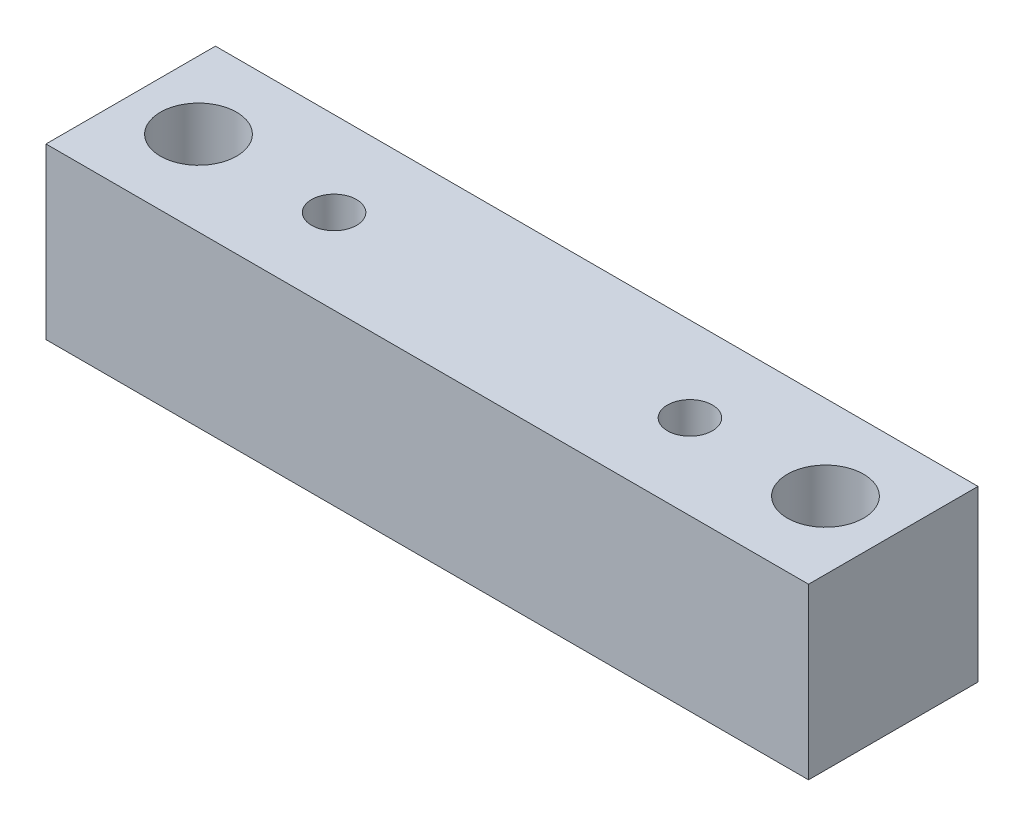
ISO-10303-21;
HEADER;
FILE_DESCRIPTION(('STEP AP214'),'2;1');
FILE_NAME('part.step','',(''),(''),'','','');
FILE_SCHEMA(('AUTOMOTIVE_DESIGN { 1 0 10303 214 1 1 1 1 }'));
ENDSEC;
DATA;
#1=APPLICATION_CONTEXT('core data for automotive mechanical design processes');
#2=APPLICATION_PROTOCOL_DEFINITION('international standard','automotive_design',2000,#1);
#3=PRODUCT_CONTEXT('',#1,'mechanical');
#4=PRODUCT('Part','Part','',(#3));
#5=PRODUCT_RELATED_PRODUCT_CATEGORY('part','',(#4));
#6=PRODUCT_DEFINITION_FORMATION('','',#4);
#7=PRODUCT_DEFINITION_CONTEXT('part definition',#1,'design');
#8=PRODUCT_DEFINITION('design','',#6,#7);
#9=PRODUCT_DEFINITION_SHAPE('','',#8);
#10=(LENGTH_UNIT() NAMED_UNIT(*) SI_UNIT(.MILLI.,.METRE.));
#11=(NAMED_UNIT(*) PLANE_ANGLE_UNIT() SI_UNIT($,.RADIAN.));
#12=(NAMED_UNIT(*) SI_UNIT($,.STERADIAN.) SOLID_ANGLE_UNIT());
#13=UNCERTAINTY_MEASURE_WITH_UNIT(LENGTH_MEASURE(1.E-05),#10,'distance_accuracy_value','');
#14=(GEOMETRIC_REPRESENTATION_CONTEXT(3) GLOBAL_UNCERTAINTY_ASSIGNED_CONTEXT((#13)) GLOBAL_UNIT_ASSIGNED_CONTEXT((#10,
#11,#12)) REPRESENTATION_CONTEXT('',''));
#15=CARTESIAN_POINT('',(0.,0.,0.));
#16=DIRECTION('',(0.,0.,1.));
#17=DIRECTION('',(1.,0.,0.));
#18=AXIS2_PLACEMENT_3D('',#15,#16,#17);
#19=CARTESIAN_POINT('',(-37.0000000000001,20.,0.));
#20=DIRECTION('',(0.,-1.,0.));
#21=DIRECTION('',(0.,0.,-1.));
#22=AXIS2_PLACEMENT_3D('',#19,#20,#21);
#23=CYLINDRICAL_SURFACE('',#22,2.75);
#24=CARTESIAN_POINT('',(-37.0000000000001,0.,0.));
#25=DIRECTION('',(0.,1.,0.));
#26=DIRECTION('',(0.,0.,1.));
#27=AXIS2_PLACEMENT_3D('',#24,#25,#26);
#28=CIRCLE('',#27,2.75);
#29=CARTESIAN_POINT('',(-37.0000000000001,0.,2.75));
#30=VERTEX_POINT('',#29);
#31=EDGE_CURVE('E301',#30,#30,#28,.T.);
#32=ORIENTED_EDGE('',*,*,#31,.F.);
#33=EDGE_LOOP('',(#32));
#34=FACE_BOUND('',#33,.T.);
#35=CARTESIAN_POINT('',(-37.0000000000001,7.,0.));
#36=DIRECTION('',(0.,1.,0.));
#37=DIRECTION('',(0.,0.,1.));
#38=AXIS2_PLACEMENT_3D('',#35,#36,#37);
#39=CIRCLE('',#38,2.75);
#40=CARTESIAN_POINT('',(-37.0000000000001,7.,2.75));
#41=VERTEX_POINT('',#40);
#42=EDGE_CURVE('E45',#41,#41,#39,.T.);
#43=ORIENTED_EDGE('',*,*,#42,.T.);
#44=EDGE_LOOP('',(#43));
#45=FACE_BOUND('',#44,.T.);
#46=ADVANCED_FACE('F41',(#34,#45),#23,.F.);
#47=CARTESIAN_POINT('',(36.9999999999999,20.,0.));
#48=DIRECTION('',(0.,-1.,0.));
#49=DIRECTION('',(0.,0.,-1.));
#50=AXIS2_PLACEMENT_3D('',#47,#48,#49);
#51=CYLINDRICAL_SURFACE('',#50,2.75);
#52=CARTESIAN_POINT('',(36.9999999999999,0.,0.));
#53=DIRECTION('',(0.,1.,0.));
#54=DIRECTION('',(0.,0.,1.));
#55=AXIS2_PLACEMENT_3D('',#52,#53,#54);
#56=CIRCLE('',#55,2.75);
#57=CARTESIAN_POINT('',(36.9999999999999,0.,2.75));
#58=VERTEX_POINT('',#57);
#59=EDGE_CURVE('E297',#58,#58,#56,.T.);
#60=ORIENTED_EDGE('',*,*,#59,.F.);
#61=EDGE_LOOP('',(#60));
#62=FACE_BOUND('',#61,.T.);
#63=CARTESIAN_POINT('',(36.9999999999999,7.,0.));
#64=DIRECTION('',(0.,1.,0.));
#65=DIRECTION('',(0.,0.,1.));
#66=AXIS2_PLACEMENT_3D('',#63,#64,#65);
#67=CIRCLE('',#66,2.75);
#68=CARTESIAN_POINT('',(36.9999999999999,7.,2.75));
#69=VERTEX_POINT('',#68);
#70=EDGE_CURVE('E356',#69,#69,#67,.T.);
#71=ORIENTED_EDGE('',*,*,#70,.T.);
#72=EDGE_LOOP('',(#71));
#73=FACE_BOUND('',#72,.T.);
#74=ADVANCED_FACE('F442',(#62,#73),#51,.F.);
#75=CARTESIAN_POINT('',(-21.,20.,0.));
#76=DIRECTION('',(0.,-1.,0.));
#77=DIRECTION('',(0.,0.,-1.));
#78=AXIS2_PLACEMENT_3D('',#75,#76,#77);
#79=CYLINDRICAL_SURFACE('',#78,2.65);
#80=CARTESIAN_POINT('',(-21.,20.,0.));
#81=DIRECTION('',(0.,1.,0.));
#82=DIRECTION('',(0.,0.,1.));
#83=AXIS2_PLACEMENT_3D('',#80,#81,#82);
#84=CIRCLE('',#83,2.65);
#85=CARTESIAN_POINT('',(-21.,20.,2.65));
#86=VERTEX_POINT('',#85);
#87=EDGE_CURVE('E310',#86,#86,#84,.T.);
#88=ORIENTED_EDGE('',*,*,#87,.T.);
#89=EDGE_LOOP('',(#88));
#90=FACE_BOUND('',#89,.T.);
#91=CARTESIAN_POINT('',(-21.,14.,0.));
#92=DIRECTION('',(0.,-1.,0.));
#93=DIRECTION('',(0.,0.,-1.));
#94=AXIS2_PLACEMENT_3D('',#91,#92,#93);
#95=CIRCLE('',#94,2.65);
#96=CARTESIAN_POINT('',(-21.,14.,-2.65));
#97=VERTEX_POINT('',#96);
#98=EDGE_CURVE('E302',#97,#97,#95,.T.);
#99=ORIENTED_EDGE('',*,*,#98,.T.);
#100=EDGE_LOOP('',(#99));
#101=FACE_BOUND('',#100,.T.);
#102=ADVANCED_FACE('F400',(#90,#101),#79,.F.);
#103=CARTESIAN_POINT('',(21.,20.,0.));
#104=DIRECTION('',(0.,-1.,0.));
#105=DIRECTION('',(0.,0.,-1.));
#106=AXIS2_PLACEMENT_3D('',#103,#104,#105);
#107=CYLINDRICAL_SURFACE('',#106,2.65);
#108=CARTESIAN_POINT('',(21.,20.,0.));
#109=DIRECTION('',(0.,1.,0.));
#110=DIRECTION('',(0.,0.,1.));
#111=AXIS2_PLACEMENT_3D('',#108,#109,#110);
#112=CIRCLE('',#111,2.65);
#113=CARTESIAN_POINT('',(21.,20.,2.64999999999999));
#114=VERTEX_POINT('',#113);
#115=EDGE_CURVE('E306',#114,#114,#112,.T.);
#116=ORIENTED_EDGE('',*,*,#115,.T.);
#117=EDGE_LOOP('',(#116));
#118=FACE_BOUND('',#117,.T.);
#119=CARTESIAN_POINT('',(21.,14.,0.));
#120=DIRECTION('',(0.,-1.,0.));
#121=DIRECTION('',(0.,0.,-1.));
#122=AXIS2_PLACEMENT_3D('',#119,#120,#121);
#123=CIRCLE('',#122,2.65);
#124=CARTESIAN_POINT('',(21.,14.,-2.65000000000001));
#125=VERTEX_POINT('',#124);
#126=EDGE_CURVE('E222',#125,#125,#123,.T.);
#127=ORIENTED_EDGE('',*,*,#126,.T.);
#128=EDGE_LOOP('',(#127));
#129=FACE_BOUND('',#128,.T.);
#130=ADVANCED_FACE('F388',(#118,#129),#107,.F.);
#131=CARTESIAN_POINT('',(0.,20.,0.));
#132=DIRECTION('',(0.,-1.,0.));
#133=DIRECTION('',(0.,0.,-1.));
#134=AXIS2_PLACEMENT_3D('',#131,#132,#133);
#135=PLANE('',#134);
#136=CARTESIAN_POINT('',(-37.0000000000001,20.,0.));
#137=DIRECTION('',(0.,1.,0.));
#138=DIRECTION('',(0.,0.,1.));
#139=AXIS2_PLACEMENT_3D('',#136,#137,#138);
#140=CIRCLE('',#139,4.5);
#141=CARTESIAN_POINT('',(-37.0000000000001,20.,4.5));
#142=VERTEX_POINT('',#141);
#143=EDGE_CURVE('E366',#142,#142,#140,.T.);
#144=ORIENTED_EDGE('',*,*,#143,.F.);
#145=EDGE_LOOP('',(#144));
#146=FACE_BOUND('',#145,.T.);
#147=CARTESIAN_POINT('',(36.9999999999999,20.,0.));
#148=DIRECTION('',(0.,1.,0.));
#149=DIRECTION('',(0.,0.,1.));
#150=AXIS2_PLACEMENT_3D('',#147,#148,#149);
#151=CIRCLE('',#150,4.5);
#152=CARTESIAN_POINT('',(36.9999999999999,20.,4.5));
#153=VERTEX_POINT('',#152);
#154=EDGE_CURVE('E188',#153,#153,#151,.T.);
#155=ORIENTED_EDGE('',*,*,#154,.F.);
#156=EDGE_LOOP('',(#155));
#157=FACE_BOUND('',#156,.T.);
#158=DIRECTION('',(0.,0.,-1.));
#159=VECTOR('',#158,1.);
#160=CARTESIAN_POINT('',(44.9999999999999,20.,9.99999999999999));
#161=LINE('',#160,#159);
#162=CARTESIAN_POINT('',(44.9999999999999,20.,9.99999999999999));
#163=VERTEX_POINT('',#162);
#164=CARTESIAN_POINT('',(44.9999999999999,20.,-9.99999999999999));
#165=VERTEX_POINT('',#164);
#166=EDGE_CURVE('E315',#163,#165,#161,.T.);
#167=ORIENTED_EDGE('',*,*,#166,.T.);
#168=DIRECTION('',(-1.,0.,0.));
#169=VECTOR('',#168,1.);
#170=CARTESIAN_POINT('',(-45.0000000000001,20.,-9.99999999999999));
#171=LINE('',#170,#169);
#172=CARTESIAN_POINT('',(-45.0000000000001,20.,-9.99999999999999));
#173=VERTEX_POINT('',#172);
#174=EDGE_CURVE('E319',#165,#173,#171,.T.);
#175=ORIENTED_EDGE('',*,*,#174,.T.);
#176=DIRECTION('',(0.,0.,1.));
#177=VECTOR('',#176,1.);
#178=CARTESIAN_POINT('',(-45.0000000000001,20.,10.));
#179=LINE('',#178,#177);
#180=CARTESIAN_POINT('',(-45.0000000000001,20.,10.));
#181=VERTEX_POINT('',#180);
#182=EDGE_CURVE('E323',#173,#181,#179,.T.);
#183=ORIENTED_EDGE('',*,*,#182,.T.);
#184=DIRECTION('',(1.,0.,0.));
#185=VECTOR('',#184,1.);
#186=CARTESIAN_POINT('',(-45.0000000000001,20.,10.));
#187=LINE('',#186,#185);
#188=EDGE_CURVE('E326',#181,#163,#187,.T.);
#189=ORIENTED_EDGE('',*,*,#188,.T.);
#190=EDGE_LOOP('',(#167,#175,#183,#189));
#191=FACE_BOUND('',#190,.T.);
#192=ORIENTED_EDGE('',*,*,#87,.F.);
#193=EDGE_LOOP('',(#192));
#194=FACE_BOUND('',#193,.T.);
#195=ORIENTED_EDGE('',*,*,#115,.F.);
#196=EDGE_LOOP('',(#195));
#197=FACE_BOUND('',#196,.T.);
#198=ADVANCED_FACE('F384',(#146,#157,#191,#194,#197),#135,.F.);
#199=CARTESIAN_POINT('',(0.,0.,0.));
#200=DIRECTION('',(0.,-1.,0.));
#201=DIRECTION('',(0.,0.,-1.));
#202=AXIS2_PLACEMENT_3D('',#199,#200,#201);
#203=PLANE('',#202);
#204=DIRECTION('',(0.5,0.,0.866025403784439));
#205=VECTOR('',#204,1.);
#206=CARTESIAN_POINT('',(-18.6328638963225,0.,-4.1));
#207=LINE('',#206,#205);
#208=CARTESIAN_POINT('',(-18.6328638963225,0.,-4.1));
#209=VERTEX_POINT('',#208);
#210=CARTESIAN_POINT('',(-16.2657277926451,0.,0.));
#211=VERTEX_POINT('',#210);
#212=EDGE_CURVE('E59',#209,#211,#207,.T.);
#213=ORIENTED_EDGE('',*,*,#212,.F.);
#214=DIRECTION('',(1.,0.,0.));
#215=VECTOR('',#214,1.);
#216=CARTESIAN_POINT('',(-23.3671361036775,0.,-4.1));
#217=LINE('',#216,#215);
#218=CARTESIAN_POINT('',(-23.3671361036775,0.,-4.1));
#219=VERTEX_POINT('',#218);
#220=EDGE_CURVE('E181',#219,#209,#217,.T.);
#221=ORIENTED_EDGE('',*,*,#220,.F.);
#222=DIRECTION('',(0.5,0.,-0.866025403784439));
#223=VECTOR('',#222,1.);
#224=CARTESIAN_POINT('',(-25.7342722073549,0.,0.));
#225=LINE('',#224,#223);
#226=CARTESIAN_POINT('',(-25.7342722073549,0.,0.));
#227=VERTEX_POINT('',#226);
#228=EDGE_CURVE('E185',#227,#219,#225,.T.);
#229=ORIENTED_EDGE('',*,*,#228,.F.);
#230=DIRECTION('',(-0.5,0.,-0.866025403784439));
#231=VECTOR('',#230,1.);
#232=CARTESIAN_POINT('',(-23.3671361036775,0.,4.1));
#233=LINE('',#232,#231);
#234=CARTESIAN_POINT('',(-23.3671361036775,0.,4.1));
#235=VERTEX_POINT('',#234);
#236=EDGE_CURVE('E212',#235,#227,#233,.T.);
#237=ORIENTED_EDGE('',*,*,#236,.F.);
#238=DIRECTION('',(-1.,0.,0.));
#239=VECTOR('',#238,1.);
#240=CARTESIAN_POINT('',(-18.6328638963225,0.,4.1));
#241=LINE('',#240,#239);
#242=CARTESIAN_POINT('',(-18.6328638963225,0.,4.1));
#243=VERTEX_POINT('',#242);
#244=EDGE_CURVE('E208',#243,#235,#241,.T.);
#245=ORIENTED_EDGE('',*,*,#244,.F.);
#246=DIRECTION('',(-0.5,0.,0.866025403784438));
#247=VECTOR('',#246,1.);
#248=CARTESIAN_POINT('',(-16.2657277926451,0.,0.));
#249=LINE('',#248,#247);
#250=EDGE_CURVE('E204',#211,#243,#249,.T.);
#251=ORIENTED_EDGE('',*,*,#250,.F.);
#252=EDGE_LOOP('',(#213,#221,#229,#237,#245,#251));
#253=FACE_BOUND('',#252,.T.);
#254=DIRECTION('',(0.5,0.,0.866025403784439));
#255=VECTOR('',#254,1.);
#256=CARTESIAN_POINT('',(23.3671361036775,0.,-4.10000000000001));
#257=LINE('',#256,#255);
#258=CARTESIAN_POINT('',(23.3671361036775,0.,-4.10000000000001));
#259=VERTEX_POINT('',#258);
#260=CARTESIAN_POINT('',(25.7342722073549,0.,0.));
#261=VERTEX_POINT('',#260);
#262=EDGE_CURVE('E67',#259,#261,#257,.T.);
#263=ORIENTED_EDGE('',*,*,#262,.F.);
#264=DIRECTION('',(1.,0.,0.));
#265=VECTOR('',#264,1.);
#266=CARTESIAN_POINT('',(18.6328638963225,0.,-4.10000000000001));
#267=LINE('',#266,#265);
#268=CARTESIAN_POINT('',(18.6328638963225,0.,-4.10000000000001));
#269=VERTEX_POINT('',#268);
#270=EDGE_CURVE('E239',#269,#259,#267,.T.);
#271=ORIENTED_EDGE('',*,*,#270,.F.);
#272=DIRECTION('',(0.5,0.,-0.866025403784438));
#273=VECTOR('',#272,1.);
#274=CARTESIAN_POINT('',(16.2657277926451,0.,0.));
#275=LINE('',#274,#273);
#276=CARTESIAN_POINT('',(16.2657277926451,0.,0.));
#277=VERTEX_POINT('',#276);
#278=EDGE_CURVE('E274',#277,#269,#275,.T.);
#279=ORIENTED_EDGE('',*,*,#278,.F.);
#280=DIRECTION('',(-0.5,0.,-0.866025403784439));
#281=VECTOR('',#280,1.);
#282=CARTESIAN_POINT('',(18.6328638963225,0.,4.1));
#283=LINE('',#282,#281);
#284=CARTESIAN_POINT('',(18.6328638963225,0.,4.1));
#285=VERTEX_POINT('',#284);
#286=EDGE_CURVE('E270',#285,#277,#283,.T.);
#287=ORIENTED_EDGE('',*,*,#286,.F.);
#288=DIRECTION('',(-1.,0.,0.));
#289=VECTOR('',#288,1.);
#290=CARTESIAN_POINT('',(23.3671361036775,0.,4.1));
#291=LINE('',#290,#289);
#292=CARTESIAN_POINT('',(23.3671361036775,0.,4.1));
#293=VERTEX_POINT('',#292);
#294=EDGE_CURVE('E266',#293,#285,#291,.T.);
#295=ORIENTED_EDGE('',*,*,#294,.F.);
#296=DIRECTION('',(-0.5,0.,0.866025403784438));
#297=VECTOR('',#296,1.);
#298=CARTESIAN_POINT('',(25.7342722073549,0.,0.));
#299=LINE('',#298,#297);
#300=EDGE_CURVE('E262',#261,#293,#299,.T.);
#301=ORIENTED_EDGE('',*,*,#300,.F.);
#302=EDGE_LOOP('',(#263,#271,#279,#287,#295,#301));
#303=FACE_BOUND('',#302,.T.);
#304=ORIENTED_EDGE('',*,*,#31,.T.);
#305=EDGE_LOOP('',(#304));
#306=FACE_BOUND('',#305,.T.);
#307=DIRECTION('',(0.,0.,-1.));
#308=VECTOR('',#307,1.);
#309=CARTESIAN_POINT('',(44.9999999999999,0.,9.99999999999999));
#310=LINE('',#309,#308);
#311=CARTESIAN_POINT('',(44.9999999999999,0.,9.99999999999999));
#312=VERTEX_POINT('',#311);
#313=CARTESIAN_POINT('',(44.9999999999999,0.,-9.99999999999999));
#314=VERTEX_POINT('',#313);
#315=EDGE_CURVE('E314',#312,#314,#310,.T.);
#316=ORIENTED_EDGE('',*,*,#315,.F.);
#317=DIRECTION('',(1.,0.,0.));
#318=VECTOR('',#317,1.);
#319=CARTESIAN_POINT('',(-45.0000000000001,0.,10.));
#320=LINE('',#319,#318);
#321=CARTESIAN_POINT('',(-45.0000000000001,0.,10.));
#322=VERTEX_POINT('',#321);
#323=EDGE_CURVE('E320',#322,#312,#320,.T.);
#324=ORIENTED_EDGE('',*,*,#323,.F.);
#325=DIRECTION('',(0.,0.,1.));
#326=VECTOR('',#325,1.);
#327=CARTESIAN_POINT('',(-45.0000000000001,0.,10.));
#328=LINE('',#327,#326);
#329=CARTESIAN_POINT('',(-45.0000000000001,0.,-9.99999999999999));
#330=VERTEX_POINT('',#329);
#331=EDGE_CURVE('E336',#330,#322,#328,.T.);
#332=ORIENTED_EDGE('',*,*,#331,.F.);
#333=DIRECTION('',(-1.,0.,0.));
#334=VECTOR('',#333,1.);
#335=CARTESIAN_POINT('',(-45.0000000000001,0.,-9.99999999999999));
#336=LINE('',#335,#334);
#337=EDGE_CURVE('E333',#314,#330,#336,.T.);
#338=ORIENTED_EDGE('',*,*,#337,.F.);
#339=EDGE_LOOP('',(#316,#324,#332,#338));
#340=FACE_BOUND('',#339,.T.);
#341=ORIENTED_EDGE('',*,*,#59,.T.);
#342=EDGE_LOOP('',(#341));
#343=FACE_BOUND('',#342,.T.);
#344=ADVANCED_FACE('F387',(#253,#303,#306,#340,#343),#203,.T.);
#345=CARTESIAN_POINT('',(44.9999999999999,20.,9.99999999999999));
#346=DIRECTION('',(-1.,0.,0.));
#347=DIRECTION('',(0.,0.,1.));
#348=AXIS2_PLACEMENT_3D('',#345,#346,#347);
#349=PLANE('',#348);
#350=ORIENTED_EDGE('',*,*,#315,.T.);
#351=DIRECTION('',(0.,-1.,0.));
#352=VECTOR('',#351,1.);
#353=CARTESIAN_POINT('',(44.9999999999999,20.,-9.99999999999999));
#354=LINE('',#353,#352);
#355=EDGE_CURVE('E11',#165,#314,#354,.T.);
#356=ORIENTED_EDGE('',*,*,#355,.F.);
#357=ORIENTED_EDGE('',*,*,#166,.F.);
#358=DIRECTION('',(0.,-1.,0.));
#359=VECTOR('',#358,1.);
#360=CARTESIAN_POINT('',(44.9999999999999,20.,9.99999999999999));
#361=LINE('',#360,#359);
#362=EDGE_CURVE('E329',#163,#312,#361,.T.);
#363=ORIENTED_EDGE('',*,*,#362,.T.);
#364=EDGE_LOOP('',(#350,#356,#357,#363));
#365=FACE_BOUND('',#364,.T.);
#366=ADVANCED_FACE('F43',(#365),#349,.F.);
#367=CARTESIAN_POINT('',(-45.0000000000001,20.,-9.99999999999999));
#368=DIRECTION('',(0.,0.,1.));
#369=DIRECTION('',(1.,0.,0.));
#370=AXIS2_PLACEMENT_3D('',#367,#368,#369);
#371=PLANE('',#370);
#372=ORIENTED_EDGE('',*,*,#337,.T.);
#373=DIRECTION('',(0.,-1.,0.));
#374=VECTOR('',#373,1.);
#375=CARTESIAN_POINT('',(-45.0000000000001,20.,-9.99999999999999));
#376=LINE('',#375,#374);
#377=EDGE_CURVE('E51',#173,#330,#376,.T.);
#378=ORIENTED_EDGE('',*,*,#377,.F.);
#379=ORIENTED_EDGE('',*,*,#174,.F.);
#380=ORIENTED_EDGE('',*,*,#355,.T.);
#381=EDGE_LOOP('',(#372,#378,#379,#380));
#382=FACE_BOUND('',#381,.T.);
#383=ADVANCED_FACE('F462',(#382),#371,.F.);
#384=CARTESIAN_POINT('',(-45.0000000000001,20.,10.));
#385=DIRECTION('',(1.,0.,0.));
#386=DIRECTION('',(0.,0.,-1.));
#387=AXIS2_PLACEMENT_3D('',#384,#385,#386);
#388=PLANE('',#387);
#389=ORIENTED_EDGE('',*,*,#331,.T.);
#390=DIRECTION('',(0.,-1.,0.));
#391=VECTOR('',#390,1.);
#392=CARTESIAN_POINT('',(-45.0000000000001,20.,10.));
#393=LINE('',#392,#391);
#394=EDGE_CURVE('E344',#181,#322,#393,.T.);
#395=ORIENTED_EDGE('',*,*,#394,.F.);
#396=ORIENTED_EDGE('',*,*,#182,.F.);
#397=ORIENTED_EDGE('',*,*,#377,.T.);
#398=EDGE_LOOP('',(#389,#395,#396,#397));
#399=FACE_BOUND('',#398,.T.);
#400=ADVANCED_FACE('F459',(#399),#388,.F.);
#401=CARTESIAN_POINT('',(-45.0000000000001,20.,10.));
#402=DIRECTION('',(0.,0.,-1.));
#403=DIRECTION('',(-1.,0.,0.));
#404=AXIS2_PLACEMENT_3D('',#401,#402,#403);
#405=PLANE('',#404);
#406=ORIENTED_EDGE('',*,*,#323,.T.);
#407=ORIENTED_EDGE('',*,*,#362,.F.);
#408=ORIENTED_EDGE('',*,*,#188,.F.);
#409=ORIENTED_EDGE('',*,*,#394,.T.);
#410=EDGE_LOOP('',(#406,#407,#408,#409));
#411=FACE_BOUND('',#410,.T.);
#412=ADVANCED_FACE('F456',(#411),#405,.F.);
#413=CARTESIAN_POINT('',(23.3671361036775,14.,-4.10000000000001));
#414=DIRECTION('',(0.866025403784438,0.,-0.5));
#415=DIRECTION('',(-0.5,0.,-0.866025403784439));
#416=AXIS2_PLACEMENT_3D('',#413,#414,#415);
#417=PLANE('',#416);
#418=ORIENTED_EDGE('',*,*,#262,.T.);
#419=DIRECTION('',(0.,-1.,0.));
#420=VECTOR('',#419,1.);
#421=CARTESIAN_POINT('',(25.7342722073549,14.,0.));
#422=LINE('',#421,#420);
#423=CARTESIAN_POINT('',(25.7342722073549,14.,0.));
#424=VERTEX_POINT('',#423);
#425=EDGE_CURVE('E259',#424,#261,#422,.T.);
#426=ORIENTED_EDGE('',*,*,#425,.F.);
#427=DIRECTION('',(0.5,0.,0.866025403784439));
#428=VECTOR('',#427,1.);
#429=CARTESIAN_POINT('',(23.3671361036775,14.,-4.10000000000001));
#430=LINE('',#429,#428);
#431=CARTESIAN_POINT('',(23.3671361036775,14.,-4.10000000000001));
#432=VERTEX_POINT('',#431);
#433=EDGE_CURVE('E234',#432,#424,#430,.T.);
#434=ORIENTED_EDGE('',*,*,#433,.F.);
#435=DIRECTION('',(0.,-1.,0.));
#436=VECTOR('',#435,1.);
#437=CARTESIAN_POINT('',(23.3671361036775,14.,-4.10000000000001));
#438=LINE('',#437,#436);
#439=EDGE_CURVE('E205',#432,#259,#438,.T.);
#440=ORIENTED_EDGE('',*,*,#439,.T.);
#441=EDGE_LOOP('',(#418,#426,#434,#440));
#442=FACE_BOUND('',#441,.T.);
#443=ADVANCED_FACE('F412',(#442),#417,.F.);
#444=CARTESIAN_POINT('',(18.6328638963225,14.,-4.10000000000001));
#445=DIRECTION('',(0.,0.,-1.));
#446=DIRECTION('',(-1.,0.,0.));
#447=AXIS2_PLACEMENT_3D('',#444,#445,#446);
#448=PLANE('',#447);
#449=ORIENTED_EDGE('',*,*,#270,.T.);
#450=ORIENTED_EDGE('',*,*,#439,.F.);
#451=DIRECTION('',(1.,0.,0.));
#452=VECTOR('',#451,1.);
#453=CARTESIAN_POINT('',(18.6328638963225,14.,-4.10000000000001));
#454=LINE('',#453,#452);
#455=CARTESIAN_POINT('',(18.6328638963225,14.,-4.10000000000001));
#456=VERTEX_POINT('',#455);
#457=EDGE_CURVE('E255',#456,#432,#454,.T.);
#458=ORIENTED_EDGE('',*,*,#457,.F.);
#459=DIRECTION('',(0.,-1.,0.));
#460=VECTOR('',#459,1.);
#461=CARTESIAN_POINT('',(18.6328638963225,14.,-4.10000000000001));
#462=LINE('',#461,#460);
#463=EDGE_CURVE('E283',#456,#269,#462,.T.);
#464=ORIENTED_EDGE('',*,*,#463,.T.);
#465=EDGE_LOOP('',(#449,#450,#458,#464));
#466=FACE_BOUND('',#465,.T.);
#467=ADVANCED_FACE('F429',(#466),#448,.F.);
#468=CARTESIAN_POINT('',(16.2657277926451,14.,0.));
#469=DIRECTION('',(-0.866025403784438,0.,-0.5));
#470=DIRECTION('',(-0.5,0.,0.866025403784438));
#471=AXIS2_PLACEMENT_3D('',#468,#469,#470);
#472=PLANE('',#471);
#473=ORIENTED_EDGE('',*,*,#278,.T.);
#474=ORIENTED_EDGE('',*,*,#463,.F.);
#475=DIRECTION('',(0.5,0.,-0.866025403784438));
#476=VECTOR('',#475,1.);
#477=CARTESIAN_POINT('',(16.2657277926451,14.,0.));
#478=LINE('',#477,#476);
#479=CARTESIAN_POINT('',(16.2657277926451,14.,0.));
#480=VERTEX_POINT('',#479);
#481=EDGE_CURVE('E251',#480,#456,#478,.T.);
#482=ORIENTED_EDGE('',*,*,#481,.F.);
#483=DIRECTION('',(0.,-1.,0.));
#484=VECTOR('',#483,1.);
#485=CARTESIAN_POINT('',(16.2657277926451,14.,0.));
#486=LINE('',#485,#484);
#487=EDGE_CURVE('E286',#480,#277,#486,.T.);
#488=ORIENTED_EDGE('',*,*,#487,.T.);
#489=EDGE_LOOP('',(#473,#474,#482,#488));
#490=FACE_BOUND('',#489,.T.);
#491=ADVANCED_FACE('F426',(#490),#472,.F.);
#492=CARTESIAN_POINT('',(18.6328638963225,14.,4.1));
#493=DIRECTION('',(-0.866025403784439,0.,0.5));
#494=DIRECTION('',(0.5,0.,0.866025403784439));
#495=AXIS2_PLACEMENT_3D('',#492,#493,#494);
#496=PLANE('',#495);
#497=ORIENTED_EDGE('',*,*,#286,.T.);
#498=ORIENTED_EDGE('',*,*,#487,.F.);
#499=DIRECTION('',(-0.5,0.,-0.866025403784439));
#500=VECTOR('',#499,1.);
#501=CARTESIAN_POINT('',(18.6328638963225,14.,4.1));
#502=LINE('',#501,#500);
#503=CARTESIAN_POINT('',(18.6328638963225,14.,4.1));
#504=VERTEX_POINT('',#503);
#505=EDGE_CURVE('E247',#504,#480,#502,.T.);
#506=ORIENTED_EDGE('',*,*,#505,.F.);
#507=DIRECTION('',(0.,-1.,0.));
#508=VECTOR('',#507,1.);
#509=CARTESIAN_POINT('',(18.6328638963225,14.,4.1));
#510=LINE('',#509,#508);
#511=EDGE_CURVE('E289',#504,#285,#510,.T.);
#512=ORIENTED_EDGE('',*,*,#511,.T.);
#513=EDGE_LOOP('',(#497,#498,#506,#512));
#514=FACE_BOUND('',#513,.T.);
#515=ADVANCED_FACE('F422',(#514),#496,.F.);
#516=CARTESIAN_POINT('',(23.3671361036775,14.,4.1));
#517=DIRECTION('',(0.,0.,1.));
#518=DIRECTION('',(1.,0.,0.));
#519=AXIS2_PLACEMENT_3D('',#516,#517,#518);
#520=PLANE('',#519);
#521=ORIENTED_EDGE('',*,*,#294,.T.);
#522=ORIENTED_EDGE('',*,*,#511,.F.);
#523=DIRECTION('',(-1.,0.,0.));
#524=VECTOR('',#523,1.);
#525=CARTESIAN_POINT('',(23.3671361036775,14.,4.1));
#526=LINE('',#525,#524);
#527=CARTESIAN_POINT('',(23.3671361036775,14.,4.1));
#528=VERTEX_POINT('',#527);
#529=EDGE_CURVE('E243',#528,#504,#526,.T.);
#530=ORIENTED_EDGE('',*,*,#529,.F.);
#531=DIRECTION('',(0.,-1.,0.));
#532=VECTOR('',#531,1.);
#533=CARTESIAN_POINT('',(23.3671361036775,14.,4.1));
#534=LINE('',#533,#532);
#535=EDGE_CURVE('E292',#528,#293,#534,.T.);
#536=ORIENTED_EDGE('',*,*,#535,.T.);
#537=EDGE_LOOP('',(#521,#522,#530,#536));
#538=FACE_BOUND('',#537,.T.);
#539=ADVANCED_FACE('F418',(#538),#520,.F.);
#540=CARTESIAN_POINT('',(25.7342722073549,14.,0.));
#541=DIRECTION('',(0.866025403784438,0.,0.5));
#542=DIRECTION('',(0.5,0.,-0.866025403784438));
#543=AXIS2_PLACEMENT_3D('',#540,#541,#542);
#544=PLANE('',#543);
#545=ORIENTED_EDGE('',*,*,#300,.T.);
#546=ORIENTED_EDGE('',*,*,#535,.F.);
#547=DIRECTION('',(-0.5,0.,0.866025403784438));
#548=VECTOR('',#547,1.);
#549=CARTESIAN_POINT('',(25.7342722073549,14.,0.));
#550=LINE('',#549,#548);
#551=EDGE_CURVE('E238',#424,#528,#550,.T.);
#552=ORIENTED_EDGE('',*,*,#551,.F.);
#553=ORIENTED_EDGE('',*,*,#425,.T.);
#554=EDGE_LOOP('',(#545,#546,#552,#553));
#555=FACE_BOUND('',#554,.T.);
#556=ADVANCED_FACE('F407',(#555),#544,.F.);
#557=CARTESIAN_POINT('',(0.,14.,0.));
#558=DIRECTION('',(0.,-1.,0.));
#559=DIRECTION('',(0.,0.,-1.));
#560=AXIS2_PLACEMENT_3D('',#557,#558,#559);
#561=PLANE('',#560);
#562=ORIENTED_EDGE('',*,*,#126,.F.);
#563=EDGE_LOOP('',(#562));
#564=FACE_BOUND('',#563,.T.);
#565=ORIENTED_EDGE('',*,*,#433,.T.);
#566=ORIENTED_EDGE('',*,*,#551,.T.);
#567=ORIENTED_EDGE('',*,*,#529,.T.);
#568=ORIENTED_EDGE('',*,*,#505,.T.);
#569=ORIENTED_EDGE('',*,*,#481,.T.);
#570=ORIENTED_EDGE('',*,*,#457,.T.);
#571=EDGE_LOOP('',(#565,#566,#567,#568,#569,#570));
#572=FACE_BOUND('',#571,.T.);
#573=ADVANCED_FACE('F404',(#564,#572),#561,.T.);
#574=CARTESIAN_POINT('',(-18.6328638963225,14.,-4.1));
#575=DIRECTION('',(0.866025403784439,0.,-0.5));
#576=DIRECTION('',(-0.5,0.,-0.866025403784439));
#577=AXIS2_PLACEMENT_3D('',#574,#575,#576);
#578=PLANE('',#577);
#579=ORIENTED_EDGE('',*,*,#212,.T.);
#580=DIRECTION('',(0.,-1.,0.));
#581=VECTOR('',#580,1.);
#582=CARTESIAN_POINT('',(-16.2657277926451,14.,0.));
#583=LINE('',#582,#581);
#584=CARTESIAN_POINT('',(-16.2657277926451,14.,0.));
#585=VERTEX_POINT('',#584);
#586=EDGE_CURVE('E155',#585,#211,#583,.T.);
#587=ORIENTED_EDGE('',*,*,#586,.F.);
#588=DIRECTION('',(0.5,0.,0.866025403784439));
#589=VECTOR('',#588,1.);
#590=CARTESIAN_POINT('',(-18.6328638963225,14.,-4.1));
#591=LINE('',#590,#589);
#592=CARTESIAN_POINT('',(-18.6328638963225,14.,-4.1));
#593=VERTEX_POINT('',#592);
#594=EDGE_CURVE('E159',#593,#585,#591,.T.);
#595=ORIENTED_EDGE('',*,*,#594,.F.);
#596=DIRECTION('',(0.,-1.,0.));
#597=VECTOR('',#596,1.);
#598=CARTESIAN_POINT('',(-18.6328638963225,14.,-4.1));
#599=LINE('',#598,#597);
#600=EDGE_CURVE('E219',#593,#209,#599,.T.);
#601=ORIENTED_EDGE('',*,*,#600,.T.);
#602=EDGE_LOOP('',(#579,#587,#595,#601));
#603=FACE_BOUND('',#602,.T.);
#604=ADVANCED_FACE('F157',(#603),#578,.F.);
#605=CARTESIAN_POINT('',(-23.3671361036775,14.,-4.1));
#606=DIRECTION('',(0.,0.,-1.));
#607=DIRECTION('',(-1.,0.,0.));
#608=AXIS2_PLACEMENT_3D('',#605,#606,#607);
#609=PLANE('',#608);
#610=ORIENTED_EDGE('',*,*,#220,.T.);
#611=ORIENTED_EDGE('',*,*,#600,.F.);
#612=DIRECTION('',(1.,0.,0.));
#613=VECTOR('',#612,1.);
#614=CARTESIAN_POINT('',(-23.3671361036775,14.,-4.1));
#615=LINE('',#614,#613);
#616=CARTESIAN_POINT('',(-23.3671361036775,14.,-4.1));
#617=VERTEX_POINT('',#616);
#618=EDGE_CURVE('E166',#617,#593,#615,.T.);
#619=ORIENTED_EDGE('',*,*,#618,.F.);
#620=DIRECTION('',(0.,-1.,0.));
#621=VECTOR('',#620,1.);
#622=CARTESIAN_POINT('',(-23.3671361036775,14.,-4.1));
#623=LINE('',#622,#621);
#624=EDGE_CURVE('E223',#617,#219,#623,.T.);
#625=ORIENTED_EDGE('',*,*,#624,.T.);
#626=EDGE_LOOP('',(#610,#611,#619,#625));
#627=FACE_BOUND('',#626,.T.);
#628=ADVANCED_FACE('F563',(#627),#609,.F.);
#629=CARTESIAN_POINT('',(-25.7342722073549,14.,0.));
#630=DIRECTION('',(-0.866025403784438,0.,-0.5));
#631=DIRECTION('',(-0.5,0.,0.866025403784439));
#632=AXIS2_PLACEMENT_3D('',#629,#630,#631);
#633=PLANE('',#632);
#634=ORIENTED_EDGE('',*,*,#228,.T.);
#635=ORIENTED_EDGE('',*,*,#624,.F.);
#636=DIRECTION('',(0.5,0.,-0.866025403784439));
#637=VECTOR('',#636,1.);
#638=CARTESIAN_POINT('',(-25.7342722073549,14.,0.));
#639=LINE('',#638,#637);
#640=CARTESIAN_POINT('',(-25.7342722073549,14.,0.));
#641=VERTEX_POINT('',#640);
#642=EDGE_CURVE('E197',#641,#617,#639,.T.);
#643=ORIENTED_EDGE('',*,*,#642,.F.);
#644=DIRECTION('',(0.,-1.,0.));
#645=VECTOR('',#644,1.);
#646=CARTESIAN_POINT('',(-25.7342722073549,14.,0.));
#647=LINE('',#646,#645);
#648=EDGE_CURVE('E226',#641,#227,#647,.T.);
#649=ORIENTED_EDGE('',*,*,#648,.T.);
#650=EDGE_LOOP('',(#634,#635,#643,#649));
#651=FACE_BOUND('',#650,.T.);
#652=ADVANCED_FACE('F570',(#651),#633,.F.);
#653=CARTESIAN_POINT('',(-23.3671361036775,14.,4.1));
#654=DIRECTION('',(-0.866025403784439,0.,0.5));
#655=DIRECTION('',(0.5,0.,0.866025403784439));
#656=AXIS2_PLACEMENT_3D('',#653,#654,#655);
#657=PLANE('',#656);
#658=ORIENTED_EDGE('',*,*,#236,.T.);
#659=ORIENTED_EDGE('',*,*,#648,.F.);
#660=DIRECTION('',(-0.5,0.,-0.866025403784439));
#661=VECTOR('',#660,1.);
#662=CARTESIAN_POINT('',(-23.3671361036775,14.,4.1));
#663=LINE('',#662,#661);
#664=CARTESIAN_POINT('',(-23.3671361036775,14.,4.1));
#665=VERTEX_POINT('',#664);
#666=EDGE_CURVE('E193',#665,#641,#663,.T.);
#667=ORIENTED_EDGE('',*,*,#666,.F.);
#668=DIRECTION('',(0.,-1.,0.));
#669=VECTOR('',#668,1.);
#670=CARTESIAN_POINT('',(-23.3671361036775,14.,4.1));
#671=LINE('',#670,#669);
#672=EDGE_CURVE('E229',#665,#235,#671,.T.);
#673=ORIENTED_EDGE('',*,*,#672,.T.);
#674=EDGE_LOOP('',(#658,#659,#667,#673));
#675=FACE_BOUND('',#674,.T.);
#676=ADVANCED_FACE('F578',(#675),#657,.F.);
#677=CARTESIAN_POINT('',(-18.6328638963225,14.,4.1));
#678=DIRECTION('',(0.,0.,1.));
#679=DIRECTION('',(1.,0.,0.));
#680=AXIS2_PLACEMENT_3D('',#677,#678,#679);
#681=PLANE('',#680);
#682=ORIENTED_EDGE('',*,*,#244,.T.);
#683=ORIENTED_EDGE('',*,*,#672,.F.);
#684=DIRECTION('',(-1.,0.,0.));
#685=VECTOR('',#684,1.);
#686=CARTESIAN_POINT('',(-18.6328638963225,14.,4.1));
#687=LINE('',#686,#685);
#688=CARTESIAN_POINT('',(-18.6328638963225,14.,4.1));
#689=VERTEX_POINT('',#688);
#690=EDGE_CURVE('E175',#689,#665,#687,.T.);
#691=ORIENTED_EDGE('',*,*,#690,.F.);
#692=DIRECTION('',(0.,-1.,0.));
#693=VECTOR('',#692,1.);
#694=CARTESIAN_POINT('',(-18.6328638963225,14.,4.1));
#695=LINE('',#694,#693);
#696=EDGE_CURVE('E165',#689,#243,#695,.T.);
#697=ORIENTED_EDGE('',*,*,#696,.T.);
#698=EDGE_LOOP('',(#682,#683,#691,#697));
#699=FACE_BOUND('',#698,.T.);
#700=ADVANCED_FACE('F586',(#699),#681,.F.);
#701=CARTESIAN_POINT('',(-16.2657277926451,14.,0.));
#702=DIRECTION('',(0.866025403784438,0.,0.5));
#703=DIRECTION('',(0.5,0.,-0.866025403784439));
#704=AXIS2_PLACEMENT_3D('',#701,#702,#703);
#705=PLANE('',#704);
#706=ORIENTED_EDGE('',*,*,#250,.T.);
#707=ORIENTED_EDGE('',*,*,#696,.F.);
#708=DIRECTION('',(-0.5,0.,0.866025403784438));
#709=VECTOR('',#708,1.);
#710=CARTESIAN_POINT('',(-16.2657277926451,14.,0.));
#711=LINE('',#710,#709);
#712=EDGE_CURVE('E169',#585,#689,#711,.T.);
#713=ORIENTED_EDGE('',*,*,#712,.F.);
#714=ORIENTED_EDGE('',*,*,#586,.T.);
#715=EDGE_LOOP('',(#706,#707,#713,#714));
#716=FACE_BOUND('',#715,.T.);
#717=ADVANCED_FACE('F170',(#716),#705,.F.);
#718=CARTESIAN_POINT('',(0.,14.,0.));
#719=DIRECTION('',(0.,-1.,0.));
#720=DIRECTION('',(0.,0.,-1.));
#721=AXIS2_PLACEMENT_3D('',#718,#719,#720);
#722=PLANE('',#721);
#723=ORIENTED_EDGE('',*,*,#98,.F.);
#724=EDGE_LOOP('',(#723));
#725=FACE_BOUND('',#724,.T.);
#726=ORIENTED_EDGE('',*,*,#594,.T.);
#727=ORIENTED_EDGE('',*,*,#712,.T.);
#728=ORIENTED_EDGE('',*,*,#690,.T.);
#729=ORIENTED_EDGE('',*,*,#666,.T.);
#730=ORIENTED_EDGE('',*,*,#642,.T.);
#731=ORIENTED_EDGE('',*,*,#618,.T.);
#732=EDGE_LOOP('',(#726,#727,#728,#729,#730,#731));
#733=FACE_BOUND('',#732,.T.);
#734=ADVANCED_FACE('F177',(#725,#733),#722,.T.);
#735=CARTESIAN_POINT('',(36.9999999999999,7.,0.));
#736=DIRECTION('',(0.,1.,0.));
#737=DIRECTION('',(0.,0.,1.));
#738=AXIS2_PLACEMENT_3D('',#735,#736,#737);
#739=CYLINDRICAL_SURFACE('',#738,4.5);
#740=CARTESIAN_POINT('',(36.9999999999999,7.,0.));
#741=DIRECTION('',(0.,1.,0.));
#742=DIRECTION('',(0.,0.,1.));
#743=AXIS2_PLACEMENT_3D('',#740,#741,#742);
#744=CIRCLE('',#743,4.5);
#745=CARTESIAN_POINT('',(36.9999999999999,7.,4.5));
#746=VERTEX_POINT('',#745);
#747=EDGE_CURVE('E372',#746,#746,#744,.T.);
#748=CARTESIAN_POINT('',(36.9999999999999,7.,4.5));
#749=CARTESIAN_POINT('',(36.9999999999999,7.13541666666667,4.5));
#750=CARTESIAN_POINT('',(36.9999999999999,7.27083333333333,4.5));
#751=CARTESIAN_POINT('',(36.9999999999999,7.54166666666667,4.5));
#752=CARTESIAN_POINT('',(36.9999999999999,7.67708333333333,4.5));
#753=CARTESIAN_POINT('',(36.9999999999999,7.94791666666667,4.5));
#754=CARTESIAN_POINT('',(36.9999999999999,8.08333333333333,4.5));
#755=CARTESIAN_POINT('',(36.9999999999999,8.35416666666667,4.5));
#756=CARTESIAN_POINT('',(36.9999999999999,8.48958333333333,4.5));
#757=CARTESIAN_POINT('',(36.9999999999999,8.76041666666667,4.5));
#758=CARTESIAN_POINT('',(36.9999999999999,8.89583333333333,4.5));
#759=CARTESIAN_POINT('',(36.9999999999999,9.16666666666667,4.5));
#760=CARTESIAN_POINT('',(36.9999999999999,9.30208333333333,4.5));
#761=CARTESIAN_POINT('',(36.9999999999999,9.57291666666667,4.5));
#762=CARTESIAN_POINT('',(36.9999999999999,9.70833333333333,4.5));
#763=CARTESIAN_POINT('',(36.9999999999999,9.97916666666667,4.5));
#764=CARTESIAN_POINT('',(36.9999999999999,10.1145833333333,4.5));
#765=CARTESIAN_POINT('',(36.9999999999999,10.3854166666667,4.5));
#766=CARTESIAN_POINT('',(36.9999999999999,10.5208333333333,4.5));
#767=CARTESIAN_POINT('',(36.9999999999999,10.7916666666667,4.5));
#768=CARTESIAN_POINT('',(36.9999999999999,10.9270833333333,4.5));
#769=CARTESIAN_POINT('',(36.9999999999999,11.1979166666667,4.5));
#770=CARTESIAN_POINT('',(36.9999999999999,11.3333333333333,4.5));
#771=CARTESIAN_POINT('',(36.9999999999999,11.6041666666667,4.5));
#772=CARTESIAN_POINT('',(36.9999999999999,11.7395833333333,4.5));
#773=CARTESIAN_POINT('',(36.9999999999999,12.0104166666667,4.5));
#774=CARTESIAN_POINT('',(36.9999999999999,12.1458333333333,4.5));
#775=CARTESIAN_POINT('',(36.9999999999999,12.4166666666667,4.5));
#776=CARTESIAN_POINT('',(36.9999999999999,12.5520833333333,4.5));
#777=CARTESIAN_POINT('',(36.9999999999999,12.8229166666667,4.5));
#778=CARTESIAN_POINT('',(36.9999999999999,12.9583333333333,4.5));
#779=CARTESIAN_POINT('',(36.9999999999999,13.2291666666667,4.5));
#780=CARTESIAN_POINT('',(36.9999999999999,13.3645833333333,4.5));
#781=CARTESIAN_POINT('',(36.9999999999999,13.6354166666667,4.5));
#782=CARTESIAN_POINT('',(36.9999999999999,13.7708333333333,4.5));
#783=CARTESIAN_POINT('',(36.9999999999999,14.0416666666667,4.5));
#784=CARTESIAN_POINT('',(36.9999999999999,14.1770833333333,4.5));
#785=CARTESIAN_POINT('',(36.9999999999999,14.4479166666667,4.5));
#786=CARTESIAN_POINT('',(36.9999999999999,14.5833333333333,4.5));
#787=CARTESIAN_POINT('',(36.9999999999999,14.8541666666667,4.5));
#788=CARTESIAN_POINT('',(36.9999999999999,14.9895833333333,4.5));
#789=CARTESIAN_POINT('',(36.9999999999999,15.2604166666667,4.5));
#790=CARTESIAN_POINT('',(36.9999999999999,15.3958333333333,4.5));
#791=CARTESIAN_POINT('',(36.9999999999999,15.6666666666667,4.5));
#792=CARTESIAN_POINT('',(36.9999999999999,15.8020833333333,4.5));
#793=CARTESIAN_POINT('',(36.9999999999999,16.0729166666667,4.5));
#794=CARTESIAN_POINT('',(36.9999999999999,16.2083333333333,4.5));
#795=CARTESIAN_POINT('',(36.9999999999999,16.4791666666667,4.5));
#796=CARTESIAN_POINT('',(36.9999999999999,16.6145833333333,4.5));
#797=CARTESIAN_POINT('',(36.9999999999999,16.8854166666667,4.5));
#798=CARTESIAN_POINT('',(36.9999999999999,17.0208333333333,4.5));
#799=CARTESIAN_POINT('',(36.9999999999999,17.2916666666667,4.5));
#800=CARTESIAN_POINT('',(36.9999999999999,17.4270833333333,4.5));
#801=CARTESIAN_POINT('',(36.9999999999999,17.6979166666667,4.5));
#802=CARTESIAN_POINT('',(36.9999999999999,17.8333333333333,4.5));
#803=CARTESIAN_POINT('',(36.9999999999999,18.1041666666667,4.5));
#804=CARTESIAN_POINT('',(36.9999999999999,18.2395833333333,4.5));
#805=CARTESIAN_POINT('',(36.9999999999999,18.5104166666667,4.5));
#806=CARTESIAN_POINT('',(36.9999999999999,18.6458333333333,4.5));
#807=CARTESIAN_POINT('',(36.9999999999999,18.9166666666667,4.5));
#808=CARTESIAN_POINT('',(36.9999999999999,19.0520833333333,4.5));
#809=CARTESIAN_POINT('',(36.9999999999999,19.3229166666667,4.5));
#810=CARTESIAN_POINT('',(36.9999999999999,19.4583333333333,4.5));
#811=CARTESIAN_POINT('',(36.9999999999999,19.7291666666667,4.5));
#812=CARTESIAN_POINT('',(36.9999999999999,19.8645833333333,4.5));
#813=CARTESIAN_POINT('',(36.9999999999999,20.,4.5));
#814=B_SPLINE_CURVE_WITH_KNOTS('',3,(#748,#749,#750,#751,#752,#753,#754,#755,#756,#757,#758,
#759,#760,#761,#762,#763,#764,#765,#766,#767,#768,#769,#770,#771,#772,#773,#774,#775,#776,#777,
#778,#779,#780,#781,#782,#783,#784,#785,#786,#787,#788,#789,#790,#791,#792,#793,#794,#795,#796,
#797,#798,#799,#800,#801,#802,#803,#804,#805,#806,#807,#808,#809,#810,#811,#812,#813),
.UNSPECIFIED.,.F.,.F.,(4,2,2,2,2,2,2,2,2,2,2,2,2,2,2,2,2,2,2,2,2,2,2,2,2,2,2,2,2,2,2,2,4),(0.,
0.40625,0.8125,1.21875,1.625,2.03125,2.4375,2.84375,3.25,3.65625,4.0625,4.46875,4.875,5.28125,
5.6875,6.09375,6.5,6.90625,7.3125,7.71875,8.125,8.53125,8.9375,9.34375,9.75,10.15625,10.5625,
10.96875,11.375,11.78125,12.1875,12.59375,13.),.UNSPECIFIED.);
#815=EDGE_CURVE('BSEAM382',#746,#153,#814,.T.);
#816=ORIENTED_EDGE('',*,*,#747,.F.);
#817=ORIENTED_EDGE('',*,*,#154,.T.);
#818=ORIENTED_EDGE('',*,*,#815,.T.);
#819=ORIENTED_EDGE('',*,*,#815,.F.);
#820=EDGE_LOOP('',(#816,#818,#817,#819));
#821=FACE_BOUND('',#820,.T.);
#822=ADVANCED_FACE('F382',(#821),#739,.F.);
#823=CARTESIAN_POINT('',(36.9999999999999,7.,0.));
#824=DIRECTION('',(0.,1.,0.));
#825=DIRECTION('',(0.,0.,1.));
#826=AXIS2_PLACEMENT_3D('',#823,#824,#825);
#827=PLANE('',#826);
#828=ORIENTED_EDGE('',*,*,#70,.F.);
#829=EDGE_LOOP('',(#828));
#830=FACE_BOUND('',#829,.T.);
#831=ORIENTED_EDGE('',*,*,#747,.T.);
#832=EDGE_LOOP('',(#831));
#833=FACE_BOUND('',#832,.T.);
#834=ADVANCED_FACE('F614',(#830,#833),#827,.T.);
#835=CARTESIAN_POINT('',(-37.0000000000001,7.,0.));
#836=DIRECTION('',(0.,1.,0.));
#837=DIRECTION('',(0.,0.,1.));
#838=AXIS2_PLACEMENT_3D('',#835,#836,#837);
#839=CYLINDRICAL_SURFACE('',#838,4.5);
#840=CARTESIAN_POINT('',(-37.0000000000001,7.,0.));
#841=DIRECTION('',(0.,1.,0.));
#842=DIRECTION('',(0.,0.,1.));
#843=AXIS2_PLACEMENT_3D('',#840,#841,#842);
#844=CIRCLE('',#843,4.5);
#845=CARTESIAN_POINT('',(-37.0000000000001,7.,4.5));
#846=VERTEX_POINT('',#845);
#847=EDGE_CURVE('E359',#846,#846,#844,.T.);
#848=CARTESIAN_POINT('',(-37.0000000000001,7.,4.5));
#849=CARTESIAN_POINT('',(-37.0000000000001,7.13541666666667,4.5));
#850=CARTESIAN_POINT('',(-37.0000000000001,7.27083333333333,4.5));
#851=CARTESIAN_POINT('',(-37.0000000000001,7.54166666666667,4.5));
#852=CARTESIAN_POINT('',(-37.0000000000001,7.67708333333333,4.5));
#853=CARTESIAN_POINT('',(-37.0000000000001,7.94791666666667,4.5));
#854=CARTESIAN_POINT('',(-37.0000000000001,8.08333333333333,4.5));
#855=CARTESIAN_POINT('',(-37.0000000000001,8.35416666666667,4.5));
#856=CARTESIAN_POINT('',(-37.0000000000001,8.48958333333333,4.5));
#857=CARTESIAN_POINT('',(-37.0000000000001,8.76041666666667,4.5));
#858=CARTESIAN_POINT('',(-37.0000000000001,8.89583333333333,4.5));
#859=CARTESIAN_POINT('',(-37.0000000000001,9.16666666666667,4.5));
#860=CARTESIAN_POINT('',(-37.0000000000001,9.30208333333333,4.5));
#861=CARTESIAN_POINT('',(-37.0000000000001,9.57291666666667,4.5));
#862=CARTESIAN_POINT('',(-37.0000000000001,9.70833333333333,4.5));
#863=CARTESIAN_POINT('',(-37.0000000000001,9.97916666666667,4.5));
#864=CARTESIAN_POINT('',(-37.0000000000001,10.1145833333333,4.5));
#865=CARTESIAN_POINT('',(-37.0000000000001,10.3854166666667,4.5));
#866=CARTESIAN_POINT('',(-37.0000000000001,10.5208333333333,4.5));
#867=CARTESIAN_POINT('',(-37.0000000000001,10.7916666666667,4.5));
#868=CARTESIAN_POINT('',(-37.0000000000001,10.9270833333333,4.5));
#869=CARTESIAN_POINT('',(-37.0000000000001,11.1979166666667,4.5));
#870=CARTESIAN_POINT('',(-37.0000000000001,11.3333333333333,4.5));
#871=CARTESIAN_POINT('',(-37.0000000000001,11.6041666666667,4.5));
#872=CARTESIAN_POINT('',(-37.0000000000001,11.7395833333333,4.5));
#873=CARTESIAN_POINT('',(-37.0000000000001,12.0104166666667,4.5));
#874=CARTESIAN_POINT('',(-37.0000000000001,12.1458333333333,4.5));
#875=CARTESIAN_POINT('',(-37.0000000000001,12.4166666666667,4.5));
#876=CARTESIAN_POINT('',(-37.0000000000001,12.5520833333333,4.5));
#877=CARTESIAN_POINT('',(-37.0000000000001,12.8229166666667,4.5));
#878=CARTESIAN_POINT('',(-37.0000000000001,12.9583333333333,4.5));
#879=CARTESIAN_POINT('',(-37.0000000000001,13.2291666666667,4.5));
#880=CARTESIAN_POINT('',(-37.0000000000001,13.3645833333333,4.5));
#881=CARTESIAN_POINT('',(-37.0000000000001,13.6354166666667,4.5));
#882=CARTESIAN_POINT('',(-37.0000000000001,13.7708333333333,4.5));
#883=CARTESIAN_POINT('',(-37.0000000000001,14.0416666666667,4.5));
#884=CARTESIAN_POINT('',(-37.0000000000001,14.1770833333333,4.5));
#885=CARTESIAN_POINT('',(-37.0000000000001,14.4479166666667,4.5));
#886=CARTESIAN_POINT('',(-37.0000000000001,14.5833333333333,4.5));
#887=CARTESIAN_POINT('',(-37.0000000000001,14.8541666666667,4.5));
#888=CARTESIAN_POINT('',(-37.0000000000001,14.9895833333333,4.5));
#889=CARTESIAN_POINT('',(-37.0000000000001,15.2604166666667,4.5));
#890=CARTESIAN_POINT('',(-37.0000000000001,15.3958333333333,4.5));
#891=CARTESIAN_POINT('',(-37.0000000000001,15.6666666666667,4.5));
#892=CARTESIAN_POINT('',(-37.0000000000001,15.8020833333333,4.5));
#893=CARTESIAN_POINT('',(-37.0000000000001,16.0729166666667,4.5));
#894=CARTESIAN_POINT('',(-37.0000000000001,16.2083333333333,4.5));
#895=CARTESIAN_POINT('',(-37.0000000000001,16.4791666666667,4.5));
#896=CARTESIAN_POINT('',(-37.0000000000001,16.6145833333333,4.5));
#897=CARTESIAN_POINT('',(-37.0000000000001,16.8854166666667,4.5));
#898=CARTESIAN_POINT('',(-37.0000000000001,17.0208333333333,4.5));
#899=CARTESIAN_POINT('',(-37.0000000000001,17.2916666666667,4.5));
#900=CARTESIAN_POINT('',(-37.0000000000001,17.4270833333333,4.5));
#901=CARTESIAN_POINT('',(-37.0000000000001,17.6979166666667,4.5));
#902=CARTESIAN_POINT('',(-37.0000000000001,17.8333333333333,4.5));
#903=CARTESIAN_POINT('',(-37.0000000000001,18.1041666666667,4.5));
#904=CARTESIAN_POINT('',(-37.0000000000001,18.2395833333333,4.5));
#905=CARTESIAN_POINT('',(-37.0000000000001,18.5104166666667,4.5));
#906=CARTESIAN_POINT('',(-37.0000000000001,18.6458333333333,4.5));
#907=CARTESIAN_POINT('',(-37.0000000000001,18.9166666666667,4.5));
#908=CARTESIAN_POINT('',(-37.0000000000001,19.0520833333333,4.5));
#909=CARTESIAN_POINT('',(-37.0000000000001,19.3229166666667,4.5));
#910=CARTESIAN_POINT('',(-37.0000000000001,19.4583333333333,4.5));
#911=CARTESIAN_POINT('',(-37.0000000000001,19.7291666666667,4.5));
#912=CARTESIAN_POINT('',(-37.0000000000001,19.8645833333333,4.5));
#913=CARTESIAN_POINT('',(-37.0000000000001,20.,4.5));
#914=B_SPLINE_CURVE_WITH_KNOTS('',3,(#848,#849,#850,#851,#852,#853,#854,#855,#856,#857,#858,
#859,#860,#861,#862,#863,#864,#865,#866,#867,#868,#869,#870,#871,#872,#873,#874,#875,#876,#877,
#878,#879,#880,#881,#882,#883,#884,#885,#886,#887,#888,#889,#890,#891,#892,#893,#894,#895,#896,
#897,#898,#899,#900,#901,#902,#903,#904,#905,#906,#907,#908,#909,#910,#911,#912,#913),
.UNSPECIFIED.,.F.,.F.,(4,2,2,2,2,2,2,2,2,2,2,2,2,2,2,2,2,2,2,2,2,2,2,2,2,2,2,2,2,2,2,2,4),(0.,
0.40625,0.8125,1.21875,1.625,2.03125,2.4375,2.84375,3.25,3.65625,4.0625,4.46875,4.875,5.28125,
5.6875,6.09375,6.5,6.90625,7.3125,7.71875,8.125,8.53125,8.9375,9.34375,9.75,10.15625,10.5625,
10.96875,11.375,11.78125,12.1875,12.59375,13.),.UNSPECIFIED.);
#915=EDGE_CURVE('BSEAM622',#846,#142,#914,.T.);
#916=ORIENTED_EDGE('',*,*,#847,.F.);
#917=ORIENTED_EDGE('',*,*,#143,.T.);
#918=ORIENTED_EDGE('',*,*,#915,.T.);
#919=ORIENTED_EDGE('',*,*,#915,.F.);
#920=EDGE_LOOP('',(#916,#918,#917,#919));
#921=FACE_BOUND('',#920,.T.);
#922=ADVANCED_FACE('F622',(#921),#839,.F.);
#923=CARTESIAN_POINT('',(-37.0000000000001,7.,0.));
#924=DIRECTION('',(0.,1.,0.));
#925=DIRECTION('',(0.,0.,1.));
#926=AXIS2_PLACEMENT_3D('',#923,#924,#925);
#927=PLANE('',#926);
#928=ORIENTED_EDGE('',*,*,#42,.F.);
#929=EDGE_LOOP('',(#928));
#930=FACE_BOUND('',#929,.T.);
#931=ORIENTED_EDGE('',*,*,#847,.T.);
#932=EDGE_LOOP('',(#931));
#933=FACE_BOUND('',#932,.T.);
#934=ADVANCED_FACE('F630',(#930,#933),#927,.T.);
#935=CLOSED_SHELL('',(#46,#74,#102,#130,#198,#344,#366,#383,#400,#412,#443,#467,#491,#515,#539,
#556,#573,#604,#628,#652,#676,#700,#717,#734,#822,#834,#922,#934));
#936=MANIFOLD_SOLID_BREP('B2',#935);
#937=ADVANCED_BREP_SHAPE_REPRESENTATION('',(#18,#936),#14);
#938=SHAPE_DEFINITION_REPRESENTATION(#9,#937);
ENDSEC;
END-ISO-10303-21;
